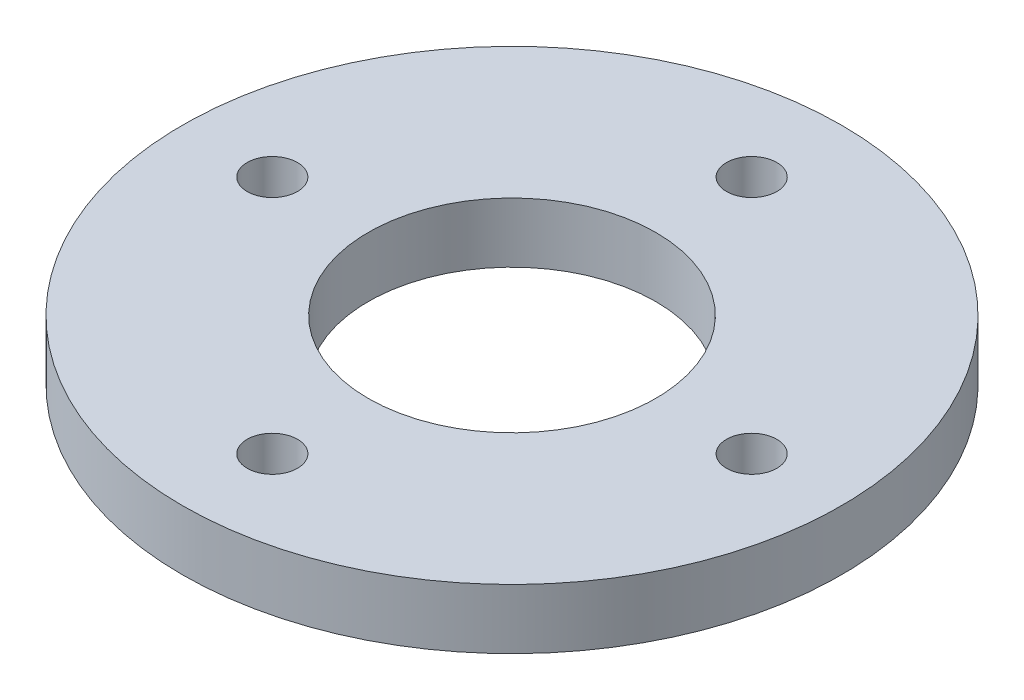
ISO-10303-21;
HEADER;
FILE_DESCRIPTION(('STEP AP214'),'2;1');
FILE_NAME('part.step','',(''),(''),'','','');
FILE_SCHEMA(('AUTOMOTIVE_DESIGN { 1 0 10303 214 1 1 1 1 }'));
ENDSEC;
DATA;
#1=APPLICATION_CONTEXT('core data for automotive mechanical design processes');
#2=APPLICATION_PROTOCOL_DEFINITION('international standard','automotive_design',2000,#1);
#3=PRODUCT_CONTEXT('',#1,'mechanical');
#4=PRODUCT('Part','Part','',(#3));
#5=PRODUCT_RELATED_PRODUCT_CATEGORY('part','',(#4));
#6=PRODUCT_DEFINITION_FORMATION('','',#4);
#7=PRODUCT_DEFINITION_CONTEXT('part definition',#1,'design');
#8=PRODUCT_DEFINITION('design','',#6,#7);
#9=PRODUCT_DEFINITION_SHAPE('','',#8);
#10=(LENGTH_UNIT() NAMED_UNIT(*) SI_UNIT(.MILLI.,.METRE.));
#11=(NAMED_UNIT(*) PLANE_ANGLE_UNIT() SI_UNIT($,.RADIAN.));
#12=(NAMED_UNIT(*) SI_UNIT($,.STERADIAN.) SOLID_ANGLE_UNIT());
#13=UNCERTAINTY_MEASURE_WITH_UNIT(LENGTH_MEASURE(1.E-05),#10,'distance_accuracy_value','');
#14=(GEOMETRIC_REPRESENTATION_CONTEXT(3) GLOBAL_UNCERTAINTY_ASSIGNED_CONTEXT((#13)) GLOBAL_UNIT_ASSIGNED_CONTEXT((#10,
#11,#12)) REPRESENTATION_CONTEXT('',''));
#15=CARTESIAN_POINT('',(0.,0.,0.));
#16=DIRECTION('',(0.,0.,1.));
#17=DIRECTION('',(1.,0.,0.));
#18=AXIS2_PLACEMENT_3D('',#15,#16,#17);
#19=CARTESIAN_POINT('',(0.,5.,0.));
#20=DIRECTION('',(0.,1.,0.));
#21=DIRECTION('',(0.,0.,1.));
#22=AXIS2_PLACEMENT_3D('',#19,#20,#21);
#23=PLANE('',#22);
#24=CARTESIAN_POINT('',(0.,5.,-20.));
#25=DIRECTION('',(0.,1.,0.));
#26=DIRECTION('',(0.,0.,1.));
#27=AXIS2_PLACEMENT_3D('',#24,#25,#26);
#28=CIRCLE('',#27,2.1);
#29=CARTESIAN_POINT('',(0.,5.,-17.9));
#30=VERTEX_POINT('',#29);
#31=EDGE_CURVE('E97',#30,#30,#28,.T.);
#32=ORIENTED_EDGE('',*,*,#31,.F.);
#33=EDGE_LOOP('',(#32));
#34=FACE_BOUND('',#33,.T.);
#35=CARTESIAN_POINT('',(0.,5.,20.));
#36=DIRECTION('',(0.,1.,0.));
#37=DIRECTION('',(0.,0.,1.));
#38=AXIS2_PLACEMENT_3D('',#35,#36,#37);
#39=CIRCLE('',#38,2.1);
#40=CARTESIAN_POINT('',(0.,5.,22.1));
#41=VERTEX_POINT('',#40);
#42=EDGE_CURVE('E90',#41,#41,#39,.T.);
#43=ORIENTED_EDGE('',*,*,#42,.F.);
#44=EDGE_LOOP('',(#43));
#45=FACE_BOUND('',#44,.T.);
#46=CARTESIAN_POINT('',(20.,5.,0.));
#47=DIRECTION('',(0.,1.,0.));
#48=DIRECTION('',(0.,0.,1.));
#49=AXIS2_PLACEMENT_3D('',#46,#47,#48);
#50=CIRCLE('',#49,2.1);
#51=CARTESIAN_POINT('',(20.,5.,2.1));
#52=VERTEX_POINT('',#51);
#53=EDGE_CURVE('E82',#52,#52,#50,.T.);
#54=ORIENTED_EDGE('',*,*,#53,.F.);
#55=EDGE_LOOP('',(#54));
#56=FACE_BOUND('',#55,.T.);
#57=CARTESIAN_POINT('',(-20.,5.,0.));
#58=DIRECTION('',(0.,1.,0.));
#59=DIRECTION('',(0.,0.,1.));
#60=AXIS2_PLACEMENT_3D('',#57,#58,#59);
#61=CIRCLE('',#60,2.1);
#62=CARTESIAN_POINT('',(-20.,5.,2.1));
#63=VERTEX_POINT('',#62);
#64=EDGE_CURVE('E74',#63,#63,#61,.T.);
#65=ORIENTED_EDGE('',*,*,#64,.F.);
#66=EDGE_LOOP('',(#65));
#67=FACE_BOUND('',#66,.T.);
#68=CARTESIAN_POINT('',(0.,5.,0.));
#69=DIRECTION('',(0.,1.,0.));
#70=DIRECTION('',(0.,0.,1.));
#71=AXIS2_PLACEMENT_3D('',#68,#69,#70);
#72=CIRCLE('',#71,27.5);
#73=CARTESIAN_POINT('',(0.,5.,27.5));
#74=VERTEX_POINT('',#73);
#75=EDGE_CURVE('E12',#74,#74,#72,.T.);
#76=ORIENTED_EDGE('',*,*,#75,.T.);
#77=EDGE_LOOP('',(#76));
#78=FACE_BOUND('',#77,.T.);
#79=CARTESIAN_POINT('',(0.,5.,0.));
#80=DIRECTION('',(0.,1.,0.));
#81=DIRECTION('',(0.,0.,1.));
#82=AXIS2_PLACEMENT_3D('',#79,#80,#81);
#83=CIRCLE('',#82,12.);
#84=CARTESIAN_POINT('',(0.,5.,12.));
#85=VERTEX_POINT('',#84);
#86=EDGE_CURVE('E64',#85,#85,#83,.T.);
#87=ORIENTED_EDGE('',*,*,#86,.F.);
#88=EDGE_LOOP('',(#87));
#89=FACE_BOUND('',#88,.T.);
#90=ADVANCED_FACE('F50',(#34,#45,#56,#67,#78,#89),#23,.T.);
#91=CARTESIAN_POINT('',(0.,0.,0.));
#92=DIRECTION('',(0.,1.,0.));
#93=DIRECTION('',(0.,0.,1.));
#94=AXIS2_PLACEMENT_3D('',#91,#92,#93);
#95=PLANE('',#94);
#96=CARTESIAN_POINT('',(0.,0.,-20.));
#97=DIRECTION('',(0.,1.,0.));
#98=DIRECTION('',(0.,0.,1.));
#99=AXIS2_PLACEMENT_3D('',#96,#97,#98);
#100=CIRCLE('',#99,2.1);
#101=CARTESIAN_POINT('',(0.,0.,-17.9));
#102=VERTEX_POINT('',#101);
#103=EDGE_CURVE('E70',#102,#102,#100,.T.);
#104=ORIENTED_EDGE('',*,*,#103,.T.);
#105=EDGE_LOOP('',(#104));
#106=FACE_BOUND('',#105,.T.);
#107=CARTESIAN_POINT('',(0.,0.,20.));
#108=DIRECTION('',(0.,1.,0.));
#109=DIRECTION('',(0.,0.,1.));
#110=AXIS2_PLACEMENT_3D('',#107,#108,#109);
#111=CIRCLE('',#110,2.1);
#112=CARTESIAN_POINT('',(0.,0.,22.1));
#113=VERTEX_POINT('',#112);
#114=EDGE_CURVE('E94',#113,#113,#111,.T.);
#115=ORIENTED_EDGE('',*,*,#114,.T.);
#116=EDGE_LOOP('',(#115));
#117=FACE_BOUND('',#116,.T.);
#118=CARTESIAN_POINT('',(20.,0.,0.));
#119=DIRECTION('',(0.,1.,0.));
#120=DIRECTION('',(0.,0.,1.));
#121=AXIS2_PLACEMENT_3D('',#118,#119,#120);
#122=CIRCLE('',#121,2.1);
#123=CARTESIAN_POINT('',(20.,0.,2.1));
#124=VERTEX_POINT('',#123);
#125=EDGE_CURVE('E86',#124,#124,#122,.T.);
#126=ORIENTED_EDGE('',*,*,#125,.T.);
#127=EDGE_LOOP('',(#126));
#128=FACE_BOUND('',#127,.T.);
#129=CARTESIAN_POINT('',(-20.,0.,0.));
#130=DIRECTION('',(0.,1.,0.));
#131=DIRECTION('',(0.,0.,1.));
#132=AXIS2_PLACEMENT_3D('',#129,#130,#131);
#133=CIRCLE('',#132,2.1);
#134=CARTESIAN_POINT('',(-20.,0.,2.1));
#135=VERTEX_POINT('',#134);
#136=EDGE_CURVE('E78',#135,#135,#133,.T.);
#137=ORIENTED_EDGE('',*,*,#136,.T.);
#138=EDGE_LOOP('',(#137));
#139=FACE_BOUND('',#138,.T.);
#140=CARTESIAN_POINT('',(0.,0.,0.));
#141=DIRECTION('',(0.,1.,0.));
#142=DIRECTION('',(0.,0.,1.));
#143=AXIS2_PLACEMENT_3D('',#140,#141,#142);
#144=CIRCLE('',#143,27.5);
#145=CARTESIAN_POINT('',(0.,0.,27.5));
#146=VERTEX_POINT('',#145);
#147=EDGE_CURVE('E54',#146,#146,#144,.T.);
#148=ORIENTED_EDGE('',*,*,#147,.F.);
#149=EDGE_LOOP('',(#148));
#150=FACE_BOUND('',#149,.T.);
#151=CARTESIAN_POINT('',(0.,0.,0.));
#152=DIRECTION('',(0.,1.,0.));
#153=DIRECTION('',(0.,0.,1.));
#154=AXIS2_PLACEMENT_3D('',#151,#152,#153);
#155=CIRCLE('',#154,12.);
#156=CARTESIAN_POINT('',(0.,0.,12.));
#157=VERTEX_POINT('',#156);
#158=EDGE_CURVE('E66',#157,#157,#155,.T.);
#159=ORIENTED_EDGE('',*,*,#158,.T.);
#160=EDGE_LOOP('',(#159));
#161=FACE_BOUND('',#160,.T.);
#162=ADVANCED_FACE('F105',(#106,#117,#128,#139,#150,#161),#95,.F.);
#163=CARTESIAN_POINT('',(0.,5.,0.));
#164=DIRECTION('',(0.,-1.,0.));
#165=DIRECTION('',(0.,0.,-1.));
#166=AXIS2_PLACEMENT_3D('',#163,#164,#165);
#167=CYLINDRICAL_SURFACE('',#166,27.5);
#168=ORIENTED_EDGE('',*,*,#75,.F.);
#169=EDGE_LOOP('',(#168));
#170=FACE_BOUND('',#169,.T.);
#171=ORIENTED_EDGE('',*,*,#147,.T.);
#172=EDGE_LOOP('',(#171));
#173=FACE_BOUND('',#172,.T.);
#174=ADVANCED_FACE('F52',(#170,#173),#167,.T.);
#175=CARTESIAN_POINT('',(0.,5.,0.));
#176=DIRECTION('',(0.,-1.,0.));
#177=DIRECTION('',(0.,0.,-1.));
#178=AXIS2_PLACEMENT_3D('',#175,#176,#177);
#179=CYLINDRICAL_SURFACE('',#178,12.);
#180=ORIENTED_EDGE('',*,*,#86,.T.);
#181=EDGE_LOOP('',(#180));
#182=FACE_BOUND('',#181,.T.);
#183=ORIENTED_EDGE('',*,*,#158,.F.);
#184=EDGE_LOOP('',(#183));
#185=FACE_BOUND('',#184,.T.);
#186=ADVANCED_FACE('F126',(#182,#185),#179,.F.);
#187=CARTESIAN_POINT('',(-20.,0.,0.));
#188=DIRECTION('',(0.,1.,0.));
#189=DIRECTION('',(0.,0.,1.));
#190=AXIS2_PLACEMENT_3D('',#187,#188,#189);
#191=CYLINDRICAL_SURFACE('',#190,2.1);
#192=ORIENTED_EDGE('',*,*,#136,.F.);
#193=EDGE_LOOP('',(#192));
#194=FACE_BOUND('',#193,.T.);
#195=ORIENTED_EDGE('',*,*,#64,.T.);
#196=EDGE_LOOP('',(#195));
#197=FACE_BOUND('',#196,.T.);
#198=ADVANCED_FACE('F129',(#194,#197),#191,.F.);
#199=CARTESIAN_POINT('',(20.,0.,0.));
#200=DIRECTION('',(0.,1.,0.));
#201=DIRECTION('',(0.,0.,1.));
#202=AXIS2_PLACEMENT_3D('',#199,#200,#201);
#203=CYLINDRICAL_SURFACE('',#202,2.1);
#204=ORIENTED_EDGE('',*,*,#125,.F.);
#205=EDGE_LOOP('',(#204));
#206=FACE_BOUND('',#205,.T.);
#207=ORIENTED_EDGE('',*,*,#53,.T.);
#208=EDGE_LOOP('',(#207));
#209=FACE_BOUND('',#208,.T.);
#210=ADVANCED_FACE('F141',(#206,#209),#203,.F.);
#211=CARTESIAN_POINT('',(0.,0.,20.));
#212=DIRECTION('',(0.,1.,0.));
#213=DIRECTION('',(0.,0.,1.));
#214=AXIS2_PLACEMENT_3D('',#211,#212,#213);
#215=CYLINDRICAL_SURFACE('',#214,2.1);
#216=ORIENTED_EDGE('',*,*,#114,.F.);
#217=EDGE_LOOP('',(#216));
#218=FACE_BOUND('',#217,.T.);
#219=ORIENTED_EDGE('',*,*,#42,.T.);
#220=EDGE_LOOP('',(#219));
#221=FACE_BOUND('',#220,.T.);
#222=ADVANCED_FACE('F111',(#218,#221),#215,.F.);
#223=CARTESIAN_POINT('',(0.,0.,-20.));
#224=DIRECTION('',(0.,1.,0.));
#225=DIRECTION('',(0.,0.,1.));
#226=AXIS2_PLACEMENT_3D('',#223,#224,#225);
#227=CYLINDRICAL_SURFACE('',#226,2.1);
#228=ORIENTED_EDGE('',*,*,#103,.F.);
#229=EDGE_LOOP('',(#228));
#230=FACE_BOUND('',#229,.T.);
#231=ORIENTED_EDGE('',*,*,#31,.T.);
#232=EDGE_LOOP('',(#231));
#233=FACE_BOUND('',#232,.T.);
#234=ADVANCED_FACE('F108',(#230,#233),#227,.F.);
#235=CLOSED_SHELL('',(#90,#162,#174,#186,#198,#210,#222,#234));
#236=MANIFOLD_SOLID_BREP('B2',#235);
#237=ADVANCED_BREP_SHAPE_REPRESENTATION('',(#18,#236),#14);
#238=SHAPE_DEFINITION_REPRESENTATION(#9,#237);
ENDSEC;
END-ISO-10303-21;
